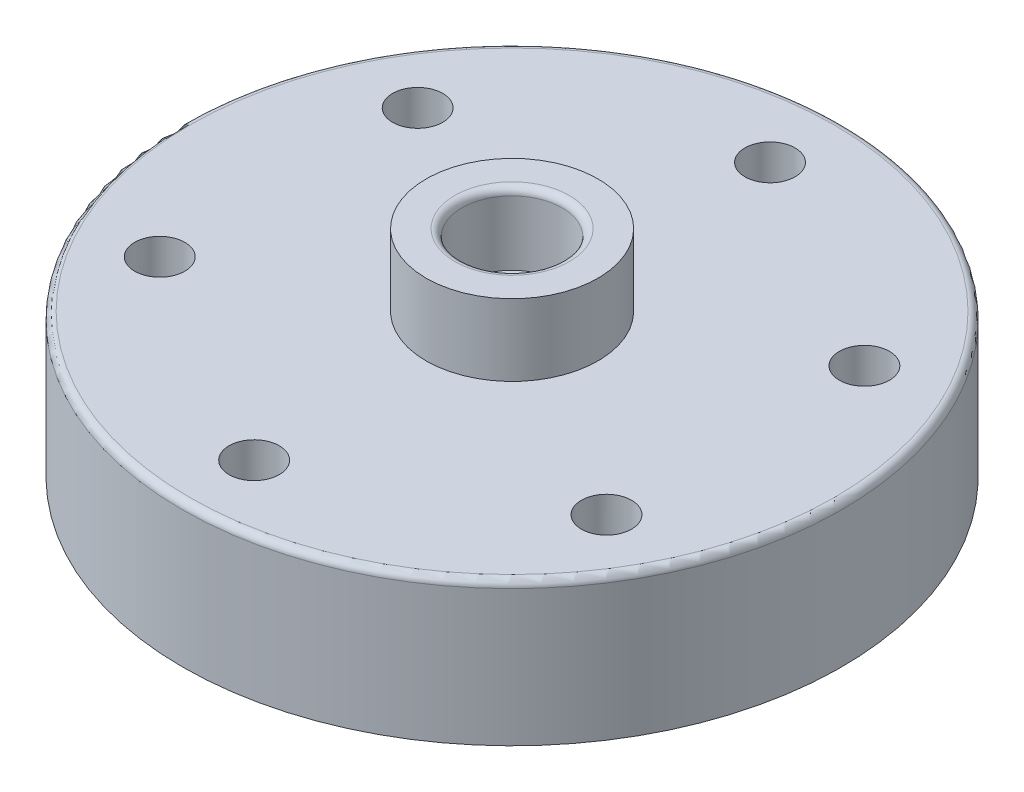
ISO-10303-21;
HEADER;
FILE_DESCRIPTION(('STEP AP214'),'2;1');
FILE_NAME('part.step','',(''),(''),'','','');
FILE_SCHEMA(('AUTOMOTIVE_DESIGN { 1 0 10303 214 1 1 1 1 }'));
ENDSEC;
DATA;
#1=APPLICATION_CONTEXT('core data for automotive mechanical design processes');
#2=APPLICATION_PROTOCOL_DEFINITION('international standard','automotive_design',2000,#1);
#3=PRODUCT_CONTEXT('',#1,'mechanical');
#4=PRODUCT('Part','Part','',(#3));
#5=PRODUCT_RELATED_PRODUCT_CATEGORY('part','',(#4));
#6=PRODUCT_DEFINITION_FORMATION('','',#4);
#7=PRODUCT_DEFINITION_CONTEXT('part definition',#1,'design');
#8=PRODUCT_DEFINITION('design','',#6,#7);
#9=PRODUCT_DEFINITION_SHAPE('','',#8);
#10=(LENGTH_UNIT() NAMED_UNIT(*) SI_UNIT(.MILLI.,.METRE.));
#11=(NAMED_UNIT(*) PLANE_ANGLE_UNIT() SI_UNIT($,.RADIAN.));
#12=(NAMED_UNIT(*) SI_UNIT($,.STERADIAN.) SOLID_ANGLE_UNIT());
#13=UNCERTAINTY_MEASURE_WITH_UNIT(LENGTH_MEASURE(1.E-05),#10,'distance_accuracy_value','');
#14=(GEOMETRIC_REPRESENTATION_CONTEXT(3) GLOBAL_UNCERTAINTY_ASSIGNED_CONTEXT((#13)) GLOBAL_UNIT_ASSIGNED_CONTEXT((#10,
#11,#12)) REPRESENTATION_CONTEXT('',''));
#15=CARTESIAN_POINT('',(0.,0.,0.));
#16=DIRECTION('',(0.,0.,1.));
#17=DIRECTION('',(1.,0.,0.));
#18=AXIS2_PLACEMENT_3D('',#15,#16,#17);
#19=CARTESIAN_POINT('',(0.,20.,0.));
#20=DIRECTION('',(0.,1.,0.));
#21=DIRECTION('',(0.,0.,1.));
#22=AXIS2_PLACEMENT_3D('',#19,#20,#21);
#23=PLANE('',#22);
#24=CARTESIAN_POINT('',(0.,20.,0.));
#25=DIRECTION('',(0.,1.,0.));
#26=DIRECTION('',(0.,0.,1.));
#27=AXIS2_PLACEMENT_3D('',#24,#25,#26);
#28=CIRCLE('',#27,12.);
#29=CARTESIAN_POINT('',(0.,20.,12.));
#30=VERTEX_POINT('',#29);
#31=EDGE_CURVE('E310',#30,#30,#28,.T.);
#32=ORIENTED_EDGE('',*,*,#31,.F.);
#33=EDGE_LOOP('',(#32));
#34=FACE_BOUND('',#33,.T.);
#35=CARTESIAN_POINT('',(0.,20.,0.));
#36=DIRECTION('',(0.,1.,0.));
#37=DIRECTION('',(0.,0.,1.));
#38=AXIS2_PLACEMENT_3D('',#35,#36,#37);
#39=CIRCLE('',#38,45.);
#40=CARTESIAN_POINT('',(0.,20.,45.));
#41=VERTEX_POINT('',#40);
#42=EDGE_CURVE('E181',#41,#41,#39,.T.);
#43=ORIENTED_EDGE('',*,*,#42,.T.);
#44=EDGE_LOOP('',(#43));
#45=FACE_BOUND('',#44,.T.);
#46=CARTESIAN_POINT('',(-31.1769145362398,20.,18.));
#47=DIRECTION('',(0.,1.,0.));
#48=DIRECTION('',(0.,0.,1.));
#49=AXIS2_PLACEMENT_3D('',#46,#47,#48);
#50=CIRCLE('',#49,3.50000000000001);
#51=CARTESIAN_POINT('',(-31.1769145362398,20.,21.5));
#52=VERTEX_POINT('',#51);
#53=EDGE_CURVE('E304',#52,#52,#50,.T.);
#54=ORIENTED_EDGE('',*,*,#53,.F.);
#55=EDGE_LOOP('',(#54));
#56=FACE_BOUND('',#55,.T.);
#57=CARTESIAN_POINT('',(31.1769145362398,20.,18.));
#58=DIRECTION('',(0.,1.,0.));
#59=DIRECTION('',(0.,0.,1.));
#60=AXIS2_PLACEMENT_3D('',#57,#58,#59);
#61=CIRCLE('',#60,3.5);
#62=CARTESIAN_POINT('',(31.1769145362398,20.,21.5));
#63=VERTEX_POINT('',#62);
#64=EDGE_CURVE('E319',#63,#63,#61,.T.);
#65=ORIENTED_EDGE('',*,*,#64,.F.);
#66=EDGE_LOOP('',(#65));
#67=FACE_BOUND('',#66,.T.);
#68=CARTESIAN_POINT('',(0.,20.,-36.));
#69=DIRECTION('',(0.,1.,0.));
#70=DIRECTION('',(0.,0.,1.));
#71=AXIS2_PLACEMENT_3D('',#68,#69,#70);
#72=CIRCLE('',#71,3.5);
#73=CARTESIAN_POINT('',(0.,20.,-32.5));
#74=VERTEX_POINT('',#73);
#75=EDGE_CURVE('E169',#74,#74,#72,.T.);
#76=ORIENTED_EDGE('',*,*,#75,.F.);
#77=EDGE_LOOP('',(#76));
#78=FACE_BOUND('',#77,.T.);
#79=CARTESIAN_POINT('',(31.1769145362398,20.,-18.));
#80=DIRECTION('',(0.,1.,0.));
#81=DIRECTION('',(0.,0.,1.));
#82=AXIS2_PLACEMENT_3D('',#79,#80,#81);
#83=CIRCLE('',#82,3.5);
#84=CARTESIAN_POINT('',(31.1769145362398,20.,-14.5));
#85=VERTEX_POINT('',#84);
#86=EDGE_CURVE('E170',#85,#85,#83,.T.);
#87=ORIENTED_EDGE('',*,*,#86,.F.);
#88=EDGE_LOOP('',(#87));
#89=FACE_BOUND('',#88,.T.);
#90=CARTESIAN_POINT('',(0.,20.,36.));
#91=DIRECTION('',(0.,1.,0.));
#92=DIRECTION('',(0.,0.,1.));
#93=AXIS2_PLACEMENT_3D('',#90,#91,#92);
#94=CIRCLE('',#93,3.5);
#95=CARTESIAN_POINT('',(0.,20.,39.5));
#96=VERTEX_POINT('',#95);
#97=EDGE_CURVE('E295',#96,#96,#94,.T.);
#98=ORIENTED_EDGE('',*,*,#97,.F.);
#99=EDGE_LOOP('',(#98));
#100=FACE_BOUND('',#99,.T.);
#101=CARTESIAN_POINT('',(-31.1769145362398,20.,-18.));
#102=DIRECTION('',(0.,1.,0.));
#103=DIRECTION('',(0.,0.,1.));
#104=AXIS2_PLACEMENT_3D('',#101,#102,#103);
#105=CIRCLE('',#104,3.5);
#106=CARTESIAN_POINT('',(-31.1769145362398,20.,-14.5));
#107=VERTEX_POINT('',#106);
#108=EDGE_CURVE('E298',#107,#107,#105,.T.);
#109=ORIENTED_EDGE('',*,*,#108,.F.);
#110=EDGE_LOOP('',(#109));
#111=FACE_BOUND('',#110,.T.);
#112=ADVANCED_FACE('F45',(#34,#45,#56,#67,#78,#89,#100,#111),#23,.T.);
#113=CARTESIAN_POINT('',(0.,0.,0.));
#114=DIRECTION('',(0.,1.,0.));
#115=DIRECTION('',(0.,0.,1.));
#116=AXIS2_PLACEMENT_3D('',#113,#114,#115);
#117=PLANE('',#116);
#118=CARTESIAN_POINT('',(0.,0.,0.));
#119=DIRECTION('',(0.,1.,0.));
#120=DIRECTION('',(0.,0.,1.));
#121=AXIS2_PLACEMENT_3D('',#118,#119,#120);
#122=CIRCLE('',#121,46.);
#123=CARTESIAN_POINT('',(0.,0.,46.));
#124=VERTEX_POINT('',#123);
#125=EDGE_CURVE('E173',#124,#124,#122,.T.);
#126=ORIENTED_EDGE('',*,*,#125,.F.);
#127=EDGE_LOOP('',(#126));
#128=FACE_BOUND('',#127,.T.);
#129=CARTESIAN_POINT('',(0.,0.,36.));
#130=DIRECTION('',(0.,1.,0.));
#131=DIRECTION('',(0.,0.,1.));
#132=AXIS2_PLACEMENT_3D('',#129,#130,#131);
#133=CIRCLE('',#132,3.5);
#134=CARTESIAN_POINT('',(-1.72543592966437,0.,32.9548611111111));
#135=VERTEX_POINT('',#134);
#136=CARTESIAN_POINT('',(1.72543592966437,0.,32.9548611111111));
#137=VERTEX_POINT('',#136);
#138=EDGE_CURVE('E314',#135,#137,#133,.T.);
#139=ORIENTED_EDGE('',*,*,#138,.T.);
#140=CARTESIAN_POINT('',(0.,0.,0.));
#141=DIRECTION('',(0.,-1.,0.));
#142=DIRECTION('',(0.,0.,-1.));
#143=AXIS2_PLACEMENT_3D('',#140,#141,#142);
#144=CIRCLE('',#143,33.);
#145=CARTESIAN_POINT('',(27.677028935578,0.,17.9717019032472));
#146=VERTEX_POINT('',#145);
#147=EDGE_CURVE('E325',#146,#137,#144,.T.);
#148=ORIENTED_EDGE('',*,*,#147,.F.);
#149=CARTESIAN_POINT('',(31.1769145362398,0.,18.));
#150=DIRECTION('',(0.,1.,0.));
#151=DIRECTION('',(0.,0.,1.));
#152=AXIS2_PLACEMENT_3D('',#149,#150,#151);
#153=CIRCLE('',#152,3.5);
#154=CARTESIAN_POINT('',(29.4024648652422,0.,14.9831592078639));
#155=VERTEX_POINT('',#154);
#156=EDGE_CURVE('E317',#146,#155,#153,.T.);
#157=ORIENTED_EDGE('',*,*,#156,.T.);
#158=CARTESIAN_POINT('',(29.4024648652422,0.,-14.9831592078639));
#159=VERTEX_POINT('',#158);
#160=EDGE_CURVE('E164',#159,#155,#144,.T.);
#161=ORIENTED_EDGE('',*,*,#160,.F.);
#162=CARTESIAN_POINT('',(31.1769145362398,0.,-18.));
#163=DIRECTION('',(0.,1.,0.));
#164=DIRECTION('',(0.,0.,1.));
#165=AXIS2_PLACEMENT_3D('',#162,#163,#164);
#166=CIRCLE('',#165,3.5);
#167=CARTESIAN_POINT('',(27.677028935578,0.,-17.9717019032472));
#168=VERTEX_POINT('',#167);
#169=EDGE_CURVE('E162',#159,#168,#166,.T.);
#170=ORIENTED_EDGE('',*,*,#169,.T.);
#171=CARTESIAN_POINT('',(1.72543592966437,0.,-32.9548611111111));
#172=VERTEX_POINT('',#171);
#173=EDGE_CURVE('E144',#172,#168,#144,.T.);
#174=ORIENTED_EDGE('',*,*,#173,.F.);
#175=CARTESIAN_POINT('',(0.,0.,-36.));
#176=DIRECTION('',(0.,1.,0.));
#177=DIRECTION('',(0.,0.,1.));
#178=AXIS2_PLACEMENT_3D('',#175,#176,#177);
#179=CIRCLE('',#178,3.5);
#180=CARTESIAN_POINT('',(-1.72543592966437,0.,-32.9548611111111));
#181=VERTEX_POINT('',#180);
#182=EDGE_CURVE('E159',#172,#181,#179,.T.);
#183=ORIENTED_EDGE('',*,*,#182,.T.);
#184=CARTESIAN_POINT('',(-27.677028935578,0.,-17.9717019032472));
#185=VERTEX_POINT('',#184);
#186=EDGE_CURVE('E166',#185,#181,#144,.T.);
#187=ORIENTED_EDGE('',*,*,#186,.F.);
#188=CARTESIAN_POINT('',(-31.1769145362398,0.,-18.));
#189=DIRECTION('',(0.,1.,0.));
#190=DIRECTION('',(0.,0.,1.));
#191=AXIS2_PLACEMENT_3D('',#188,#189,#190);
#192=CIRCLE('',#191,3.5);
#193=CARTESIAN_POINT('',(-29.4024648652422,0.,-14.9831592078639));
#194=VERTEX_POINT('',#193);
#195=EDGE_CURVE('E301',#185,#194,#192,.T.);
#196=ORIENTED_EDGE('',*,*,#195,.T.);
#197=CARTESIAN_POINT('',(-29.4024648652422,0.,14.9831592078639));
#198=VERTEX_POINT('',#197);
#199=EDGE_CURVE('E392',#198,#194,#144,.T.);
#200=ORIENTED_EDGE('',*,*,#199,.F.);
#201=CARTESIAN_POINT('',(-31.1769145362398,0.,18.));
#202=DIRECTION('',(0.,1.,0.));
#203=DIRECTION('',(0.,0.,1.));
#204=AXIS2_PLACEMENT_3D('',#201,#202,#203);
#205=CIRCLE('',#204,3.50000000000001);
#206=CARTESIAN_POINT('',(-27.677028935578,0.,17.9717019032472));
#207=VERTEX_POINT('',#206);
#208=EDGE_CURVE('E300',#198,#207,#205,.T.);
#209=ORIENTED_EDGE('',*,*,#208,.T.);
#210=EDGE_CURVE('E393',#135,#207,#144,.T.);
#211=ORIENTED_EDGE('',*,*,#210,.F.);
#212=EDGE_LOOP('',(#139,#148,#157,#161,#170,#174,#183,#187,#196,#200,#209,#211));
#213=FACE_BOUND('',#212,.T.);
#214=ADVANCED_FACE('F157',(#128,#213),#117,.F.);
#215=CARTESIAN_POINT('',(0.,20.,0.));
#216=DIRECTION('',(0.,-1.,0.));
#217=DIRECTION('',(0.,0.,-1.));
#218=AXIS2_PLACEMENT_3D('',#215,#216,#217);
#219=CYLINDRICAL_SURFACE('',#218,46.);
#220=CARTESIAN_POINT('',(-45.8257569495584,8.,-4.));
#221=CARTESIAN_POINT('',(-45.8257592529,8.22422557676734,-3.99999022069832));
#222=CARTESIAN_POINT('',(-45.827420373911,8.44860291677105,-3.98108264099248));
#223=CARTESIAN_POINT('',(-45.8338851426979,8.8911468052187,-3.90593649586812));
#224=CARTESIAN_POINT('',(-45.8386923314329,9.10930606602828,-3.84965586532193));
#225=CARTESIAN_POINT('',(-45.8509006782946,9.53294038218834,-3.70140589755577));
#226=CARTESIAN_POINT('',(-45.8583003450063,9.73842265066475,-3.60945707647571));
#227=CARTESIAN_POINT('',(-45.8748580339149,10.1309889505903,-3.39251792049866));
#228=CARTESIAN_POINT('',(-45.8840156854883,10.318076847445,-3.26753454795257));
#229=CARTESIAN_POINT('',(-45.9030861076185,10.6691123445422,-2.98769880141533));
#230=CARTESIAN_POINT('',(-45.913000687119,10.8330016580444,-2.83277342711226));
#231=CARTESIAN_POINT('',(-45.9324513082598,11.1324867709531,-2.49760627828392));
#232=CARTESIAN_POINT('',(-45.9419873331913,11.2680813225915,-2.31736338787004));
#233=CARTESIAN_POINT('',(-45.9596237085428,11.5073236299316,-1.93632769735621));
#234=CARTESIAN_POINT('',(-45.9677217712603,11.6109206699038,-1.73550293927632));
#235=CARTESIAN_POINT('',(-45.9815502523707,11.7829028108073,-1.31922689103131));
#236=CARTESIAN_POINT('',(-45.9872807154839,11.8512885768313,-1.10377587722316));
#237=CARTESIAN_POINT('',(-45.9957156744668,11.950738388164,-0.664945572705922));
#238=CARTESIAN_POINT('',(-45.9984278444434,11.9818970993774,-0.441587885472249));
#239=CARTESIAN_POINT('',(-46.0005466562249,12.0063010187252,0.00720231248861334));
#240=CARTESIAN_POINT('',(-45.9999533644025,11.9995469881339,0.232634781464177));
#241=CARTESIAN_POINT('',(-45.9955344216359,11.9483944484898,0.67853330338372));
#242=CARTESIAN_POINT('',(-45.9917175116836,11.9040977370386,0.899011133019085));
#243=CARTESIAN_POINT('',(-45.9812906260433,11.7792756038703,1.32939055972902));
#244=CARTESIAN_POINT('',(-45.9746806217873,11.698749811598,1.53929204860317));
#245=CARTESIAN_POINT('',(-45.9593960403952,11.5036422647318,1.94288377568549));
#246=CARTESIAN_POINT('',(-45.9507187091837,11.3890150293829,2.13655191869819));
#247=CARTESIAN_POINT('',(-45.932274323738,11.1289914651673,2.50193828147549));
#248=CARTESIAN_POINT('',(-45.9225072454084,10.9835944558844,2.67365601571295));
#249=CARTESIAN_POINT('',(-45.9029425505567,10.6655851399144,2.99086253715119));
#250=CARTESIAN_POINT('',(-45.8931449399444,10.4928843573568,3.1362626395445));
#251=CARTESIAN_POINT('',(-45.8746558920775,10.1254778521385,3.39602107305605));
#252=CARTESIAN_POINT('',(-45.865964455857,9.93077210890999,3.51037937515944));
#253=CARTESIAN_POINT('',(-45.850670411278,9.52481920635842,3.70480521446751));
#254=CARTESIAN_POINT('',(-45.8440680940838,9.31356974642228,3.78486797239148));
#255=CARTESIAN_POINT('',(-45.8337056034403,8.88055651609487,3.90836346467413));
#256=CARTESIAN_POINT('',(-45.8299453648504,8.65879298681009,3.95179703857705));
#257=CARTESIAN_POINT('',(-45.8257035170242,8.21182321306429,4.00068860868453));
#258=CARTESIAN_POINT('',(-45.8252112237107,7.98663060233967,4.00627035728181));
#259=CARTESIAN_POINT('',(-45.8275328089982,7.53851296081435,3.97962416771679));
#260=CARTESIAN_POINT('',(-45.8303466539778,7.31558790697723,3.94739661405193));
#261=CARTESIAN_POINT('',(-45.8389537309647,6.87868977626192,3.84614988501926));
#262=CARTESIAN_POINT('',(-45.8447422732169,6.66470317995917,3.77718861590927));
#263=CARTESIAN_POINT('',(-45.858642654131,6.25133717852214,3.60449093074963));
#264=CARTESIAN_POINT('',(-45.8667545333191,6.05195802826274,3.50075390809871));
#265=CARTESIAN_POINT('',(-45.8844134825169,5.67290071195108,3.26113691800223));
#266=CARTESIAN_POINT('',(-45.8939642072595,5.49327478991483,3.12517457760168));
#267=CARTESIAN_POINT('',(-45.9134124490953,5.15935122960597,2.82508520773206));
#268=CARTESIAN_POINT('',(-45.9233099726793,5.00505406571297,2.66095765087739));
#269=CARTESIAN_POINT('',(-45.9423685156078,4.72574466388273,2.30866162942055));
#270=CARTESIAN_POINT('',(-45.9515274669664,4.60081289729236,2.12042923775605));
#271=CARTESIAN_POINT('',(-45.9680470345569,4.38433311113863,1.72558473478786));
#272=CARTESIAN_POINT('',(-45.9754076701262,4.29278473259684,1.51897282115266));
#273=CARTESIAN_POINT('',(-45.9874917831598,4.14580827107724,1.09352107058706));
#274=CARTESIAN_POINT('',(-45.9922188753643,4.09033066063395,0.874698450214241));
#275=CARTESIAN_POINT('',(-45.99851799679,4.01690871467125,0.4308013473218));
#276=CARTESIAN_POINT('',(-46.0000900915684,3.99896359926939,0.205726994804516));
#277=CARTESIAN_POINT('',(-45.9999021602536,4.00112550416265,-0.243491894884627));
#278=CARTESIAN_POINT('',(-45.9981531072966,4.02110721340983,-0.467637050347373));
#279=CARTESIAN_POINT('',(-45.9915410873719,4.09829394979887,-0.909374922573149));
#280=CARTESIAN_POINT('',(-45.9866781164929,4.1554990236955,-1.12696763110556));
#281=CARTESIAN_POINT('',(-45.9743837234326,4.30547618976575,-1.54943018460914));
#282=CARTESIAN_POINT('',(-45.9669524855247,4.39824573023852,-1.75430094113752));
#283=CARTESIAN_POINT('',(-45.9503523182712,4.61670435075986,-2.1455808043822));
#284=CARTESIAN_POINT('',(-45.9411834128787,4.74239297703984,-2.33199016552824));
#285=CARTESIAN_POINT('',(-45.9221005338321,5.02359247990173,-2.68169741837223));
#286=CARTESIAN_POINT('',(-45.9121842991298,5.17919626323597,-2.84492048041319));
#287=CARTESIAN_POINT('',(-45.8927436381485,5.51563705394214,-3.14300123474661));
#288=CARTESIAN_POINT('',(-45.8832193071528,5.69648015134188,-3.27785206131377));
#289=CARTESIAN_POINT('',(-45.8656201830606,6.07864732534923,-3.51556036878055));
#290=CARTESIAN_POINT('',(-45.8575483364789,6.2800117645991,-3.61835311929828));
#291=CARTESIAN_POINT('',(-45.8438038501868,6.69707685352975,-3.78853603666767));
#292=CARTESIAN_POINT('',(-45.8381284641021,6.91276076293664,-3.85596675043421));
#293=CARTESIAN_POINT('',(-45.8312733845173,7.27475587728481,-3.93640984643492));
#294=CARTESIAN_POINT('',(-45.8292142857283,7.41874157160406,-3.96022427649646));
#295=CARTESIAN_POINT('',(-45.8264553214086,7.70846345833754,-3.99202250917625));
#296=CARTESIAN_POINT('',(-45.8257554518344,7.85419964554288,-4.00000635888943));
#297=CARTESIAN_POINT('',(-45.8257569495584,8.,-4.));
#298=B_SPLINE_CURVE_WITH_KNOTS('',3,(#220,#221,#222,#223,#224,#225,#226,#227,#228,#229,#230,
#231,#232,#233,#234,#235,#236,#237,#238,#239,#240,#241,#242,#243,#244,#245,#246,#247,#248,#249,
#250,#251,#252,#253,#254,#255,#256,#257,#258,#259,#260,#261,#262,#263,#264,#265,#266,#267,#268,
#269,#270,#271,#272,#273,#274,#275,#276,#277,#278,#279,#280,#281,#282,#283,#284,#285,#286,#287,
#288,#289,#290,#291,#292,#293,#294,#295,#296,#297),.UNSPECIFIED.,.T.,.F.,(4,2,2,2,2,2,2,2,2,2,2,
2,2,2,2,2,2,2,2,2,2,2,2,2,2,2,2,2,2,2,2,2,2,2,2,2,2,2,4),(0.,0.672144367468725,1.34504655027074,
2.01756225611789,2.68993633564789,3.36397086630315,4.03803511486633,4.71316232981279,
5.38827679206224,6.06167080444288,6.73505129535883,7.40661172404849,8.07817902168978,
8.75064602815269,9.42312790652577,10.0978353469387,10.7725434180003,11.4473454829356,
12.1221320809255,12.7947114699811,13.4672840193756,14.1387994635935,14.8103266218154,
15.4835891813588,16.1568643489264,16.8319635562739,17.5070555039268,18.1812185387189,
18.8553675650324,19.5272930649873,20.1992194089225,20.8710975521,21.5429664343535,
22.2169566520649,22.8911097798494,23.5666154470793,24.2413448612288,24.6784010614077,
25.1154559613712),.UNSPECIFIED.);
#299=CARTESIAN_POINT('',(-45.8257569495584,8.,-4.));
#300=VERTEX_POINT('',#299);
#301=EDGE_CURVE('E230',#300,#300,#298,.T.);
#302=ORIENTED_EDGE('',*,*,#301,.T.);
#303=EDGE_LOOP('',(#302));
#304=FACE_BOUND('',#303,.T.);
#305=CARTESIAN_POINT('',(0.,19.,0.));
#306=DIRECTION('',(0.,1.,0.));
#307=DIRECTION('',(0.,0.,1.));
#308=AXIS2_PLACEMENT_3D('',#305,#306,#307);
#309=CIRCLE('',#308,46.);
#310=CARTESIAN_POINT('',(0.,19.,46.));
#311=VERTEX_POINT('',#310);
#312=EDGE_CURVE('E184',#311,#311,#309,.F.);
#313=ORIENTED_EDGE('',*,*,#312,.T.);
#314=EDGE_LOOP('',(#313));
#315=FACE_BOUND('',#314,.T.);
#316=ORIENTED_EDGE('',*,*,#125,.T.);
#317=EDGE_LOOP('',(#316));
#318=FACE_BOUND('',#317,.T.);
#319=ADVANCED_FACE('F217',(#304,#315,#318),#219,.T.);
#320=CARTESIAN_POINT('',(0.,20.,-36.));
#321=DIRECTION('',(0.,-1.,0.));
#322=DIRECTION('',(0.,0.,-1.));
#323=AXIS2_PLACEMENT_3D('',#320,#321,#322);
#324=CYLINDRICAL_SURFACE('',#323,3.5);
#325=DIRECTION('',(0.,-1.,0.));
#326=VECTOR('',#325,1.);
#327=CARTESIAN_POINT('',(-1.72543592966432,7.,-32.9548611111111));
#328=LINE('',#327,#326);
#329=CARTESIAN_POINT('',(-1.72543592966437,14.,-32.9548611111111));
#330=VERTEX_POINT('',#329);
#331=EDGE_CURVE('E74',#181,#330,#328,.F.);
#332=ORIENTED_EDGE('',*,*,#331,.F.);
#333=ORIENTED_EDGE('',*,*,#182,.F.);
#334=DIRECTION('',(0.,-1.,0.));
#335=VECTOR('',#334,1.);
#336=CARTESIAN_POINT('',(1.72543592966432,7.,-32.9548611111111));
#337=LINE('',#336,#335);
#338=CARTESIAN_POINT('',(1.72543592966437,14.,-32.9548611111111));
#339=VERTEX_POINT('',#338);
#340=EDGE_CURVE('E141',#339,#172,#337,.T.);
#341=ORIENTED_EDGE('',*,*,#340,.F.);
#342=CARTESIAN_POINT('',(0.,14.,-36.));
#343=DIRECTION('',(0.,-1.,0.));
#344=DIRECTION('',(0.,0.,-1.));
#345=AXIS2_PLACEMENT_3D('',#342,#343,#344);
#346=CIRCLE('',#345,3.5);
#347=EDGE_CURVE('E350',#339,#330,#346,.T.);
#348=ORIENTED_EDGE('',*,*,#347,.T.);
#349=EDGE_LOOP('',(#332,#333,#341,#348));
#350=FACE_BOUND('',#349,.T.);
#351=ORIENTED_EDGE('',*,*,#75,.T.);
#352=EDGE_LOOP('',(#351));
#353=FACE_BOUND('',#352,.T.);
#354=ADVANCED_FACE('F167',(#350,#353),#324,.F.);
#355=CARTESIAN_POINT('',(31.1769145362398,20.,-18.));
#356=DIRECTION('',(0.,-1.,0.));
#357=DIRECTION('',(0.,0.,-1.));
#358=AXIS2_PLACEMENT_3D('',#355,#356,#357);
#359=CYLINDRICAL_SURFACE('',#358,3.5);
#360=DIRECTION('',(0.,-1.,0.));
#361=VECTOR('',#360,1.);
#362=CARTESIAN_POINT('',(27.6770289355779,7.,-17.9717019032473));
#363=LINE('',#362,#361);
#364=CARTESIAN_POINT('',(27.677028935578,14.,-17.9717019032472));
#365=VERTEX_POINT('',#364);
#366=EDGE_CURVE('E151',#168,#365,#363,.F.);
#367=ORIENTED_EDGE('',*,*,#366,.F.);
#368=ORIENTED_EDGE('',*,*,#169,.F.);
#369=DIRECTION('',(0.,-1.,0.));
#370=VECTOR('',#369,1.);
#371=CARTESIAN_POINT('',(29.4024648652422,7.,-14.9831592078639));
#372=LINE('',#371,#370);
#373=CARTESIAN_POINT('',(29.4024648652422,14.,-14.9831592078639));
#374=VERTEX_POINT('',#373);
#375=EDGE_CURVE('E336',#374,#159,#372,.T.);
#376=ORIENTED_EDGE('',*,*,#375,.F.);
#377=CARTESIAN_POINT('',(31.1769145362398,14.,-18.));
#378=DIRECTION('',(0.,-1.,0.));
#379=DIRECTION('',(0.,0.,-1.));
#380=AXIS2_PLACEMENT_3D('',#377,#378,#379);
#381=CIRCLE('',#380,3.5);
#382=EDGE_CURVE('E349',#374,#365,#381,.T.);
#383=ORIENTED_EDGE('',*,*,#382,.T.);
#384=EDGE_LOOP('',(#367,#368,#376,#383));
#385=FACE_BOUND('',#384,.T.);
#386=ORIENTED_EDGE('',*,*,#86,.T.);
#387=EDGE_LOOP('',(#386));
#388=FACE_BOUND('',#387,.T.);
#389=ADVANCED_FACE('F280',(#385,#388),#359,.F.);
#390=CARTESIAN_POINT('',(31.1769145362398,20.,18.));
#391=DIRECTION('',(0.,-1.,0.));
#392=DIRECTION('',(0.,0.,-1.));
#393=AXIS2_PLACEMENT_3D('',#390,#391,#392);
#394=CYLINDRICAL_SURFACE('',#393,3.5);
#395=DIRECTION('',(0.,-1.,0.));
#396=VECTOR('',#395,1.);
#397=CARTESIAN_POINT('',(29.4024648652423,7.,14.9831592078638));
#398=LINE('',#397,#396);
#399=CARTESIAN_POINT('',(29.4024648652422,14.,14.9831592078639));
#400=VERTEX_POINT('',#399);
#401=EDGE_CURVE('E331',#155,#400,#398,.F.);
#402=ORIENTED_EDGE('',*,*,#401,.F.);
#403=ORIENTED_EDGE('',*,*,#156,.F.);
#404=DIRECTION('',(0.,-1.,0.));
#405=VECTOR('',#404,1.);
#406=CARTESIAN_POINT('',(27.677028935578,7.,17.9717019032473));
#407=LINE('',#406,#405);
#408=CARTESIAN_POINT('',(27.677028935578,14.,17.9717019032472));
#409=VERTEX_POINT('',#408);
#410=EDGE_CURVE('E330',#409,#146,#407,.T.);
#411=ORIENTED_EDGE('',*,*,#410,.F.);
#412=CARTESIAN_POINT('',(31.1769145362398,14.,18.));
#413=DIRECTION('',(0.,-1.,0.));
#414=DIRECTION('',(0.,0.,-1.));
#415=AXIS2_PLACEMENT_3D('',#412,#413,#414);
#416=CIRCLE('',#415,3.5);
#417=EDGE_CURVE('E332',#409,#400,#416,.T.);
#418=ORIENTED_EDGE('',*,*,#417,.T.);
#419=EDGE_LOOP('',(#402,#403,#411,#418));
#420=FACE_BOUND('',#419,.T.);
#421=ORIENTED_EDGE('',*,*,#64,.T.);
#422=EDGE_LOOP('',(#421));
#423=FACE_BOUND('',#422,.T.);
#424=ADVANCED_FACE('F277',(#420,#423),#394,.F.);
#425=CARTESIAN_POINT('',(0.,20.,36.));
#426=DIRECTION('',(0.,-1.,0.));
#427=DIRECTION('',(0.,0.,-1.));
#428=AXIS2_PLACEMENT_3D('',#425,#426,#427);
#429=CYLINDRICAL_SURFACE('',#428,3.5);
#430=DIRECTION('',(0.,-1.,0.));
#431=VECTOR('',#430,1.);
#432=CARTESIAN_POINT('',(1.72543592966432,7.,32.9548611111111));
#433=LINE('',#432,#431);
#434=CARTESIAN_POINT('',(1.72543592966437,14.,32.9548611111111));
#435=VERTEX_POINT('',#434);
#436=EDGE_CURVE('E339',#137,#435,#433,.F.);
#437=ORIENTED_EDGE('',*,*,#436,.F.);
#438=ORIENTED_EDGE('',*,*,#138,.F.);
#439=DIRECTION('',(0.,-1.,0.));
#440=VECTOR('',#439,1.);
#441=CARTESIAN_POINT('',(-1.72543592966431,7.,32.9548611111111));
#442=LINE('',#441,#440);
#443=CARTESIAN_POINT('',(-1.72543592966437,14.,32.9548611111111));
#444=VERTEX_POINT('',#443);
#445=EDGE_CURVE('E365',#444,#135,#442,.T.);
#446=ORIENTED_EDGE('',*,*,#445,.F.);
#447=CARTESIAN_POINT('',(0.,14.,36.));
#448=DIRECTION('',(0.,-1.,0.));
#449=DIRECTION('',(0.,0.,-1.));
#450=AXIS2_PLACEMENT_3D('',#447,#448,#449);
#451=CIRCLE('',#450,3.5);
#452=EDGE_CURVE('E358',#444,#435,#451,.T.);
#453=ORIENTED_EDGE('',*,*,#452,.T.);
#454=EDGE_LOOP('',(#437,#438,#446,#453));
#455=FACE_BOUND('',#454,.T.);
#456=ORIENTED_EDGE('',*,*,#97,.T.);
#457=EDGE_LOOP('',(#456));
#458=FACE_BOUND('',#457,.T.);
#459=ADVANCED_FACE('F273',(#455,#458),#429,.F.);
#460=CARTESIAN_POINT('',(-31.1769145362398,20.,18.));
#461=DIRECTION('',(0.,-1.,0.));
#462=DIRECTION('',(0.,0.,-1.));
#463=AXIS2_PLACEMENT_3D('',#460,#461,#462);
#464=CYLINDRICAL_SURFACE('',#463,3.50000000000001);
#465=DIRECTION('',(0.,-1.,0.));
#466=VECTOR('',#465,1.);
#467=CARTESIAN_POINT('',(-27.6770289355779,7.,17.9717019032473));
#468=LINE('',#467,#466);
#469=CARTESIAN_POINT('',(-27.677028935578,14.,17.9717019032472));
#470=VERTEX_POINT('',#469);
#471=EDGE_CURVE('E363',#207,#470,#468,.F.);
#472=ORIENTED_EDGE('',*,*,#471,.F.);
#473=ORIENTED_EDGE('',*,*,#208,.F.);
#474=DIRECTION('',(0.,-1.,0.));
#475=VECTOR('',#474,1.);
#476=CARTESIAN_POINT('',(-29.4024648652423,7.,14.9831592078638));
#477=LINE('',#476,#475);
#478=CARTESIAN_POINT('',(-29.4024648652422,14.,14.9831592078639));
#479=VERTEX_POINT('',#478);
#480=EDGE_CURVE('E356',#479,#198,#477,.T.);
#481=ORIENTED_EDGE('',*,*,#480,.F.);
#482=CARTESIAN_POINT('',(-31.1769145362398,14.,18.));
#483=DIRECTION('',(0.,-1.,0.));
#484=DIRECTION('',(0.,0.,-1.));
#485=AXIS2_PLACEMENT_3D('',#482,#483,#484);
#486=CIRCLE('',#485,3.50000000000001);
#487=EDGE_CURVE('E351',#479,#470,#486,.T.);
#488=ORIENTED_EDGE('',*,*,#487,.T.);
#489=EDGE_LOOP('',(#472,#473,#481,#488));
#490=FACE_BOUND('',#489,.T.);
#491=ORIENTED_EDGE('',*,*,#53,.T.);
#492=EDGE_LOOP('',(#491));
#493=FACE_BOUND('',#492,.T.);
#494=ADVANCED_FACE('F269',(#490,#493),#464,.F.);
#495=CARTESIAN_POINT('',(-31.1769145362398,20.,-18.));
#496=DIRECTION('',(0.,-1.,0.));
#497=DIRECTION('',(0.,0.,-1.));
#498=AXIS2_PLACEMENT_3D('',#495,#496,#497);
#499=CYLINDRICAL_SURFACE('',#498,3.5);
#500=DIRECTION('',(0.,-1.,0.));
#501=VECTOR('',#500,1.);
#502=CARTESIAN_POINT('',(-29.4024648652423,7.,-14.9831592078638));
#503=LINE('',#502,#501);
#504=CARTESIAN_POINT('',(-29.4024648652422,14.,-14.9831592078639));
#505=VERTEX_POINT('',#504);
#506=EDGE_CURVE('E192',#194,#505,#503,.F.);
#507=ORIENTED_EDGE('',*,*,#506,.F.);
#508=ORIENTED_EDGE('',*,*,#195,.F.);
#509=DIRECTION('',(0.,-1.,0.));
#510=VECTOR('',#509,1.);
#511=CARTESIAN_POINT('',(-27.677028935578,7.,-17.9717019032473));
#512=LINE('',#511,#510);
#513=CARTESIAN_POINT('',(-27.677028935578,14.,-17.9717019032472));
#514=VERTEX_POINT('',#513);
#515=EDGE_CURVE('E190',#514,#185,#512,.T.);
#516=ORIENTED_EDGE('',*,*,#515,.F.);
#517=CARTESIAN_POINT('',(-31.1769145362398,14.,-18.));
#518=DIRECTION('',(0.,-1.,0.));
#519=DIRECTION('',(0.,0.,-1.));
#520=AXIS2_PLACEMENT_3D('',#517,#518,#519);
#521=CIRCLE('',#520,3.5);
#522=EDGE_CURVE('E187',#514,#505,#521,.T.);
#523=ORIENTED_EDGE('',*,*,#522,.T.);
#524=EDGE_LOOP('',(#507,#508,#516,#523));
#525=FACE_BOUND('',#524,.T.);
#526=ORIENTED_EDGE('',*,*,#108,.T.);
#527=EDGE_LOOP('',(#526));
#528=FACE_BOUND('',#527,.T.);
#529=ADVANCED_FACE('F266',(#525,#528),#499,.F.);
#530=CARTESIAN_POINT('',(0.,19.,0.));
#531=DIRECTION('',(0.,1.,0.));
#532=DIRECTION('',(0.,0.,1.));
#533=AXIS2_PLACEMENT_3D('',#530,#531,#532);
#534=TOROIDAL_SURFACE('',#533,45.,1.);
#535=ORIENTED_EDGE('',*,*,#312,.F.);
#536=EDGE_LOOP('',(#535));
#537=FACE_BOUND('',#536,.T.);
#538=ORIENTED_EDGE('',*,*,#42,.F.);
#539=EDGE_LOOP('',(#538));
#540=FACE_BOUND('',#539,.T.);
#541=ADVANCED_FACE('F228',(#537,#540),#534,.T.);
#542=CARTESIAN_POINT('',(0.,30.,0.));
#543=DIRECTION('',(0.,-1.,0.));
#544=DIRECTION('',(0.,0.,-1.));
#545=AXIS2_PLACEMENT_3D('',#542,#543,#544);
#546=CYLINDRICAL_SURFACE('',#545,12.);
#547=CARTESIAN_POINT('',(0.,30.,0.));
#548=DIRECTION('',(0.,1.,0.));
#549=DIRECTION('',(0.,0.,1.));
#550=AXIS2_PLACEMENT_3D('',#547,#548,#549);
#551=CIRCLE('',#550,12.);
#552=CARTESIAN_POINT('',(0.,30.,12.));
#553=VERTEX_POINT('',#552);
#554=EDGE_CURVE('E307',#553,#553,#551,.T.);
#555=ORIENTED_EDGE('',*,*,#554,.F.);
#556=EDGE_LOOP('',(#555));
#557=FACE_BOUND('',#556,.T.);
#558=ORIENTED_EDGE('',*,*,#31,.T.);
#559=EDGE_LOOP('',(#558));
#560=FACE_BOUND('',#559,.T.);
#561=ADVANCED_FACE('F261',(#557,#560),#546,.T.);
#562=CARTESIAN_POINT('',(0.,30.,0.));
#563=DIRECTION('',(0.,1.,0.));
#564=DIRECTION('',(0.,0.,1.));
#565=AXIS2_PLACEMENT_3D('',#562,#563,#564);
#566=PLANE('',#565);
#567=CARTESIAN_POINT('',(0.,30.,0.));
#568=DIRECTION('',(0.,1.,0.));
#569=DIRECTION('',(0.,0.,1.));
#570=AXIS2_PLACEMENT_3D('',#567,#568,#569);
#571=CIRCLE('',#570,8.);
#572=CARTESIAN_POINT('',(0.,30.,8.));
#573=VERTEX_POINT('',#572);
#574=EDGE_CURVE('E11',#573,#573,#571,.F.);
#575=ORIENTED_EDGE('',*,*,#574,.T.);
#576=EDGE_LOOP('',(#575));
#577=FACE_BOUND('',#576,.T.);
#578=ORIENTED_EDGE('',*,*,#554,.T.);
#579=EDGE_LOOP('',(#578));
#580=FACE_BOUND('',#579,.T.);
#581=ADVANCED_FACE('F258',(#577,#580),#566,.T.);
#582=CARTESIAN_POINT('',(0.,14.,0.));
#583=DIRECTION('',(0.,-1.,0.));
#584=DIRECTION('',(0.,0.,-1.));
#585=AXIS2_PLACEMENT_3D('',#582,#583,#584);
#586=CYLINDRICAL_SURFACE('',#585,33.);
#587=ORIENTED_EDGE('',*,*,#331,.T.);
#588=CARTESIAN_POINT('',(0.,14.,0.));
#589=DIRECTION('',(0.,-1.,0.));
#590=DIRECTION('',(0.,0.,-1.));
#591=AXIS2_PLACEMENT_3D('',#588,#589,#590);
#592=CIRCLE('',#591,33.);
#593=EDGE_CURVE('E163',#514,#330,#592,.T.);
#594=ORIENTED_EDGE('',*,*,#593,.F.);
#595=ORIENTED_EDGE('',*,*,#515,.T.);
#596=ORIENTED_EDGE('',*,*,#186,.T.);
#597=EDGE_LOOP('',(#587,#594,#595,#596));
#598=FACE_BOUND('',#597,.T.);
#599=ADVANCED_FACE('F257',(#598),#586,.F.);
#600=ORIENTED_EDGE('',*,*,#340,.T.);
#601=ORIENTED_EDGE('',*,*,#173,.T.);
#602=ORIENTED_EDGE('',*,*,#366,.T.);
#603=EDGE_CURVE('E147',#339,#365,#592,.T.);
#604=ORIENTED_EDGE('',*,*,#603,.F.);
#605=EDGE_LOOP('',(#600,#601,#602,#604));
#606=FACE_BOUND('',#605,.T.);
#607=ADVANCED_FACE('F143',(#606),#586,.F.);
#608=ORIENTED_EDGE('',*,*,#375,.T.);
#609=ORIENTED_EDGE('',*,*,#160,.T.);
#610=ORIENTED_EDGE('',*,*,#401,.T.);
#611=EDGE_CURVE('E352',#374,#400,#592,.T.);
#612=ORIENTED_EDGE('',*,*,#611,.F.);
#613=EDGE_LOOP('',(#608,#609,#610,#612));
#614=FACE_BOUND('',#613,.T.);
#615=ADVANCED_FACE('F400',(#614),#586,.F.);
#616=ORIENTED_EDGE('',*,*,#410,.T.);
#617=ORIENTED_EDGE('',*,*,#147,.T.);
#618=ORIENTED_EDGE('',*,*,#436,.T.);
#619=EDGE_CURVE('E371',#409,#435,#592,.T.);
#620=ORIENTED_EDGE('',*,*,#619,.F.);
#621=EDGE_LOOP('',(#616,#617,#618,#620));
#622=FACE_BOUND('',#621,.T.);
#623=ADVANCED_FACE('F370',(#622),#586,.F.);
#624=ORIENTED_EDGE('',*,*,#445,.T.);
#625=ORIENTED_EDGE('',*,*,#210,.T.);
#626=ORIENTED_EDGE('',*,*,#471,.T.);
#627=EDGE_CURVE('E376',#444,#470,#592,.T.);
#628=ORIENTED_EDGE('',*,*,#627,.F.);
#629=EDGE_LOOP('',(#624,#625,#626,#628));
#630=FACE_BOUND('',#629,.T.);
#631=ADVANCED_FACE('F255',(#630),#586,.F.);
#632=CARTESIAN_POINT('',(-32.7566787083184,8.,-4.));
#633=CARTESIAN_POINT('',(-32.7566818366577,7.77620550348074,-3.99999045298508));
#634=CARTESIAN_POINT('',(-32.7589969177124,7.55226978964191,-3.98115515343243));
#635=CARTESIAN_POINT('',(-32.7680039727008,7.110626634477,-3.90631302023377));
#636=CARTESIAN_POINT('',(-32.7747005616006,6.89292601310311,-3.85026699225597));
#637=CARTESIAN_POINT('',(-32.7917012296198,6.47021148580929,-3.70267655289125));
#638=CARTESIAN_POINT('',(-32.8020029032309,6.26518922727268,-3.61115580778966));
#639=CARTESIAN_POINT('',(-32.8250500965597,5.87345279800498,-3.39526371924446));
#640=CARTESIAN_POINT('',(-32.8377951872424,5.68673542184092,-3.27089814151645));
#641=CARTESIAN_POINT('',(-32.864368406131,5.33588554601347,-2.99214417405283));
#642=CARTESIAN_POINT('',(-32.8782013482531,5.17186345073592,-2.83761726919589));
#643=CARTESIAN_POINT('',(-32.905348295857,4.87201333478101,-2.50322501027308));
#644=CARTESIAN_POINT('',(-32.9186622758482,4.73618669760225,-2.32335841356232));
#645=CARTESIAN_POINT('',(-32.9433202079721,4.49618911358668,-1.94270104483964));
#646=CARTESIAN_POINT('',(-32.9546579142429,4.39211777612165,-1.74184703190994));
#647=CARTESIAN_POINT('',(-32.9740330113373,4.21922286326735,-1.325352481192));
#648=CARTESIAN_POINT('',(-32.9820705176523,4.15039805439581,-1.10971246115218));
#649=CARTESIAN_POINT('',(-32.993905717215,4.05027889992132,-0.670894532630864));
#650=CARTESIAN_POINT('',(-32.9977241084167,4.0188012813973,-0.447759006205902));
#651=CARTESIAN_POINT('',(-33.0007614848467,3.99370220196665,0.000657902440336723));
#652=CARTESIAN_POINT('',(-32.9999806408196,4.00007933571949,0.225939204690659));
#653=CARTESIAN_POINT('',(-32.9939243045577,4.05036154861505,0.671006287963216));
#654=CARTESIAN_POINT('',(-32.9886724189773,4.09406952855121,0.890814702972182));
#655=CARTESIAN_POINT('',(-32.974290708158,4.21746479194921,1.31995337515371));
#656=CARTESIAN_POINT('',(-32.9651608129403,4.2971527246728,1.52928344316775));
#657=CARTESIAN_POINT('',(-32.9440083562255,4.4904565201915,1.93213533023985));
#658=CARTESIAN_POINT('',(-32.931978510434,4.6041579966361,2.12561567058178));
#659=CARTESIAN_POINT('',(-32.9063727008439,4.86219905355329,2.49082341217299));
#660=CARTESIAN_POINT('',(-32.8927966703688,5.00653995552617,2.66254987465172));
#661=CARTESIAN_POINT('',(-32.8655155228159,5.32286724018325,2.98053255244169));
#662=CARTESIAN_POINT('',(-32.8518101368879,5.49502534583268,3.12661796887099));
#663=CARTESIAN_POINT('',(-32.8259012315593,5.86150929373647,3.38784512845958));
#664=CARTESIAN_POINT('',(-32.8136977163744,6.0558351982126,3.50298678476122));
#665=CARTESIAN_POINT('',(-32.7921742461928,6.4612872652783,3.69906598308285));
#666=CARTESIAN_POINT('',(-32.7828554012633,6.67241985615631,3.77999036212115));
#667=CARTESIAN_POINT('',(-32.7681782798095,7.10541530478076,3.90518910413138));
#668=CARTESIAN_POINT('',(-32.762819824179,7.32727767679543,3.94946512451534));
#669=CARTESIAN_POINT('',(-32.7567026814491,7.77392784681436,3.99988519584663));
#670=CARTESIAN_POINT('',(-32.7559150285832,7.99868815614393,4.00626937814872));
#671=CARTESIAN_POINT('',(-32.7589520971464,8.44607515067929,3.98135765376567));
#672=CARTESIAN_POINT('',(-32.7627767262732,8.66870187849305,3.95006250113017));
#673=CARTESIAN_POINT('',(-32.7745810041736,9.10478580014237,3.85088243715065));
#674=CARTESIAN_POINT('',(-32.7825474977128,9.31826972283158,3.78311334910617));
#675=CARTESIAN_POINT('',(-32.8017272208065,9.73084331109527,3.6130281927127));
#676=CARTESIAN_POINT('',(-32.8129405579643,9.92993249934121,3.51071097938724));
#677=CARTESIAN_POINT('',(-32.8374200222184,10.3091529822973,3.27384173326402));
#678=CARTESIAN_POINT('',(-32.8506960788503,10.4891850938432,3.13913195401655));
#679=CARTESIAN_POINT('',(-32.8777737228222,10.8241700082929,2.84152499642419));
#680=CARTESIAN_POINT('',(-32.8915753293471,10.9791218945623,2.67862678829609));
#681=CARTESIAN_POINT('',(-32.9182377149735,11.2603888302814,2.32821925622029));
#682=CARTESIAN_POINT('',(-32.931093067008,11.3865462764056,2.14058295469221));
#683=CARTESIAN_POINT('',(-32.9543337105298,11.6055536685178,1.74664463837716));
#684=CARTESIAN_POINT('',(-32.9647190492445,11.698404251362,1.54034298058246));
#685=CARTESIAN_POINT('',(-32.9818253693875,11.8479008451535,1.11545816602638));
#686=CARTESIAN_POINT('',(-32.98855563168,11.9046386163826,0.89690768438068));
#687=CARTESIAN_POINT('',(-32.9976319498885,11.9805976860595,0.453295431839334));
#688=CARTESIAN_POINT('',(-32.9999781911159,11.9998205702532,0.228233936570891));
#689=CARTESIAN_POINT('',(-33.000021367475,12.0001757912835,-0.220471313794805));
#690=CARTESIAN_POINT('',(-32.9977479977708,11.9815514127923,-0.444114912587441));
#691=CARTESIAN_POINT('',(-32.9888663257534,11.9072552066791,-0.885069092955426));
#692=CARTESIAN_POINT('',(-32.9822580252319,11.851583394369,-1.10237967714821));
#693=CARTESIAN_POINT('',(-32.9654458725196,11.7048476023688,-1.5244721638081));
#694=CARTESIAN_POINT('',(-32.9552431301393,11.6137945460056,-1.72925791053233));
#695=CARTESIAN_POINT('',(-32.9323730883384,11.39890614139,-2.12068092912073));
#696=CARTESIAN_POINT('',(-32.9197057667317,11.2750704980243,-2.30731803758764));
#697=CARTESIAN_POINT('',(-32.8932241859913,10.9972296410101,-2.65838965314681));
#698=CARTESIAN_POINT('',(-32.8794033429218,10.8430432971494,-2.82268032326465));
#699=CARTESIAN_POINT('',(-32.8522257784064,10.5092521832838,-3.12315293120787));
#700=CARTESIAN_POINT('',(-32.8388691678779,10.3296413900166,-3.25932818941034));
#701=CARTESIAN_POINT('',(-32.8140805805222,9.94935509493326,-3.50012370208704));
#702=CARTESIAN_POINT('',(-32.8026557772711,9.74860538589136,-3.60462743792878));
#703=CARTESIAN_POINT('',(-32.7831085801835,9.33238255541906,-3.77829295203558));
#704=CARTESIAN_POINT('',(-32.7749825744407,9.11692584062966,-3.84749340586574));
#705=CARTESIAN_POINT('',(-32.7649388059801,8.7502798683407,-3.93190579331955));
#706=CARTESIAN_POINT('',(-32.7618565652437,8.60140891644043,-3.95740470646339));
#707=CARTESIAN_POINT('',(-32.7577254688871,8.30171336570611,-3.99145496920686));
#708=CARTESIAN_POINT('',(-32.7566765991008,8.15088878049001,-4.00000643687607));
#709=CARTESIAN_POINT('',(-32.7566787083184,8.,-4.));
#710=B_SPLINE_CURVE_WITH_KNOTS('',3,(#632,#633,#634,#635,#636,#637,#638,#639,#640,#641,#642,
#643,#644,#645,#646,#647,#648,#649,#650,#651,#652,#653,#654,#655,#656,#657,#658,#659,#660,#661,
#662,#663,#664,#665,#666,#667,#668,#669,#670,#671,#672,#673,#674,#675,#676,#677,#678,#679,#680,
#681,#682,#683,#684,#685,#686,#687,#688,#689,#690,#691,#692,#693,#694,#695,#696,#697,#698,#699,
#700,#701,#702,#703,#704,#705,#706,#707,#708,#709),.UNSPECIFIED.,.T.,.F.,(4,2,2,2,2,2,2,2,2,2,2,
2,2,2,2,2,2,2,2,2,2,2,2,2,2,2,2,2,2,2,2,2,2,2,2,2,2,2,4),(0.,0.67083230252087,1.34237232097104,
2.01346510316178,2.68444015720846,3.35857240178021,4.03273771695039,4.70899650098513,
5.38523161715034,6.05813435270303,6.73101210720265,7.40035901245525,8.06971799662072,
8.74077617066323,9.41186329380664,10.087263693043,10.762665988076,11.4383278665181,
12.1139591866663,12.7853042281999,13.4566358348076,14.1258480927268,14.7950825315168,
15.467644495884,16.140231035558,16.8164150504307,17.4925861353889,18.1670321819991,
18.8414497193086,19.5115457711023,20.1816415459413,20.8515306048434,21.5214256943854,
22.1954469793233,22.8696282135606,23.5462604462507,24.2221498121776,24.6744476783457,
25.1267423934303),.UNSPECIFIED.);
#711=CARTESIAN_POINT('',(-32.7566787083184,8.,-4.));
#712=VERTEX_POINT('',#711);
#713=EDGE_CURVE('E49',#712,#712,#710,.T.);
#714=ORIENTED_EDGE('',*,*,#713,.T.);
#715=EDGE_LOOP('',(#714));
#716=FACE_BOUND('',#715,.T.);
#717=ORIENTED_EDGE('',*,*,#480,.T.);
#718=ORIENTED_EDGE('',*,*,#199,.T.);
#719=ORIENTED_EDGE('',*,*,#506,.T.);
#720=EDGE_CURVE('E66',#479,#505,#592,.T.);
#721=ORIENTED_EDGE('',*,*,#720,.F.);
#722=EDGE_LOOP('',(#717,#718,#719,#721));
#723=FACE_BOUND('',#722,.T.);
#724=ADVANCED_FACE('F250',(#716,#723),#586,.F.);
#725=CARTESIAN_POINT('',(0.,14.,0.));
#726=DIRECTION('',(0.,-1.,0.));
#727=DIRECTION('',(0.,0.,-1.));
#728=AXIS2_PLACEMENT_3D('',#725,#726,#727);
#729=PLANE('',#728);
#730=CARTESIAN_POINT('',(0.,14.,0.));
#731=DIRECTION('',(0.,-1.,0.));
#732=DIRECTION('',(0.,0.,-1.));
#733=AXIS2_PLACEMENT_3D('',#730,#731,#732);
#734=CIRCLE('',#733,2.5);
#735=CARTESIAN_POINT('',(0.,14.,-2.5));
#736=VERTEX_POINT('',#735);
#737=EDGE_CURVE('E382',#736,#736,#734,.T.);
#738=ORIENTED_EDGE('',*,*,#737,.F.);
#739=EDGE_LOOP('',(#738));
#740=FACE_BOUND('',#739,.T.);
#741=ORIENTED_EDGE('',*,*,#603,.T.);
#742=ORIENTED_EDGE('',*,*,#382,.F.);
#743=ORIENTED_EDGE('',*,*,#611,.T.);
#744=ORIENTED_EDGE('',*,*,#417,.F.);
#745=ORIENTED_EDGE('',*,*,#619,.T.);
#746=ORIENTED_EDGE('',*,*,#452,.F.);
#747=ORIENTED_EDGE('',*,*,#627,.T.);
#748=ORIENTED_EDGE('',*,*,#487,.F.);
#749=ORIENTED_EDGE('',*,*,#720,.T.);
#750=ORIENTED_EDGE('',*,*,#522,.F.);
#751=ORIENTED_EDGE('',*,*,#593,.T.);
#752=ORIENTED_EDGE('',*,*,#347,.F.);
#753=EDGE_LOOP('',(#741,#742,#743,#744,#745,#746,#747,#748,#749,#750,#751,#752));
#754=FACE_BOUND('',#753,.T.);
#755=ADVANCED_FACE('F247',(#740,#754),#729,.T.);
#756=CARTESIAN_POINT('',(0.,20.,0.));
#757=DIRECTION('',(0.,-1.,0.));
#758=DIRECTION('',(0.,0.,-1.));
#759=AXIS2_PLACEMENT_3D('',#756,#757,#758);
#760=CYLINDRICAL_SURFACE('',#759,2.5);
#761=CARTESIAN_POINT('',(0.,20.,0.));
#762=DIRECTION('',(0.,-1.,0.));
#763=DIRECTION('',(0.,0.,-1.));
#764=AXIS2_PLACEMENT_3D('',#761,#762,#763);
#765=CIRCLE('',#764,2.5);
#766=CARTESIAN_POINT('',(0.,20.,-2.5));
#767=VERTEX_POINT('',#766);
#768=EDGE_CURVE('E384',#767,#767,#765,.T.);
#769=ORIENTED_EDGE('',*,*,#768,.F.);
#770=EDGE_LOOP('',(#769));
#771=FACE_BOUND('',#770,.T.);
#772=ORIENTED_EDGE('',*,*,#737,.T.);
#773=EDGE_LOOP('',(#772));
#774=FACE_BOUND('',#773,.T.);
#775=ADVANCED_FACE('F242',(#771,#774),#760,.F.);
#776=CARTESIAN_POINT('',(0.,20.,0.));
#777=DIRECTION('',(0.,1.,0.));
#778=DIRECTION('',(0.,0.,1.));
#779=AXIS2_PLACEMENT_3D('',#776,#777,#778);
#780=PLANE('',#779);
#781=CARTESIAN_POINT('',(0.,20.,0.));
#782=DIRECTION('',(0.,1.,0.));
#783=DIRECTION('',(0.,0.,1.));
#784=AXIS2_PLACEMENT_3D('',#781,#782,#783);
#785=CIRCLE('',#784,7.);
#786=CARTESIAN_POINT('',(0.,20.,7.));
#787=VERTEX_POINT('',#786);
#788=EDGE_CURVE('E236',#787,#787,#785,.T.);
#789=ORIENTED_EDGE('',*,*,#788,.T.);
#790=EDGE_LOOP('',(#789));
#791=FACE_BOUND('',#790,.T.);
#792=ORIENTED_EDGE('',*,*,#768,.T.);
#793=EDGE_LOOP('',(#792));
#794=FACE_BOUND('',#793,.T.);
#795=ADVANCED_FACE('F208',(#791,#794),#780,.T.);
#796=CARTESIAN_POINT('',(0.,20.,0.));
#797=DIRECTION('',(0.,1.,0.));
#798=DIRECTION('',(0.,0.,1.));
#799=AXIS2_PLACEMENT_3D('',#796,#797,#798);
#800=CYLINDRICAL_SURFACE('',#799,7.);
#801=CARTESIAN_POINT('',(0.,29.,0.));
#802=DIRECTION('',(0.,1.,0.));
#803=DIRECTION('',(0.,0.,1.));
#804=AXIS2_PLACEMENT_3D('',#801,#802,#803);
#805=CIRCLE('',#804,7.);
#806=CARTESIAN_POINT('',(0.,29.,7.));
#807=VERTEX_POINT('',#806);
#808=EDGE_CURVE('E59',#807,#807,#805,.T.);
#809=ORIENTED_EDGE('',*,*,#808,.T.);
#810=EDGE_LOOP('',(#809));
#811=FACE_BOUND('',#810,.T.);
#812=ORIENTED_EDGE('',*,*,#788,.F.);
#813=EDGE_LOOP('',(#812));
#814=FACE_BOUND('',#813,.T.);
#815=ADVANCED_FACE('F197',(#811,#814),#800,.F.);
#816=CARTESIAN_POINT('',(0.,29.,0.));
#817=DIRECTION('',(0.,1.,0.));
#818=DIRECTION('',(0.,0.,1.));
#819=AXIS2_PLACEMENT_3D('',#816,#817,#818);
#820=TOROIDAL_SURFACE('',#819,8.,1.);
#821=ORIENTED_EDGE('',*,*,#574,.F.);
#822=EDGE_LOOP('',(#821));
#823=FACE_BOUND('',#822,.T.);
#824=ORIENTED_EDGE('',*,*,#808,.F.);
#825=EDGE_LOOP('',(#824));
#826=FACE_BOUND('',#825,.T.);
#827=ADVANCED_FACE('F47',(#823,#826),#820,.T.);
#828=CARTESIAN_POINT('',(-54.,8.,0.));
#829=DIRECTION('',(1.,0.,0.));
#830=DIRECTION('',(0.,0.,-1.));
#831=AXIS2_PLACEMENT_3D('',#828,#829,#830);
#832=CYLINDRICAL_SURFACE('',#831,4.);
#833=ORIENTED_EDGE('',*,*,#713,.F.);
#834=EDGE_LOOP('',(#833));
#835=FACE_BOUND('',#834,.T.);
#836=ORIENTED_EDGE('',*,*,#301,.F.);
#837=EDGE_LOOP('',(#836));
#838=FACE_BOUND('',#837,.T.);
#839=ADVANCED_FACE('F201',(#835,#838),#832,.F.);
#840=CLOSED_SHELL('',(#112,#214,#319,#354,#389,#424,#459,#494,#529,#541,#561,#581,#599,#607,
#615,#623,#631,#724,#755,#775,#795,#815,#827,#839));
#841=MANIFOLD_SOLID_BREP('B2',#840);
#842=ADVANCED_BREP_SHAPE_REPRESENTATION('',(#18,#841),#14);
#843=SHAPE_DEFINITION_REPRESENTATION(#9,#842);
ENDSEC;
END-ISO-10303-21;
